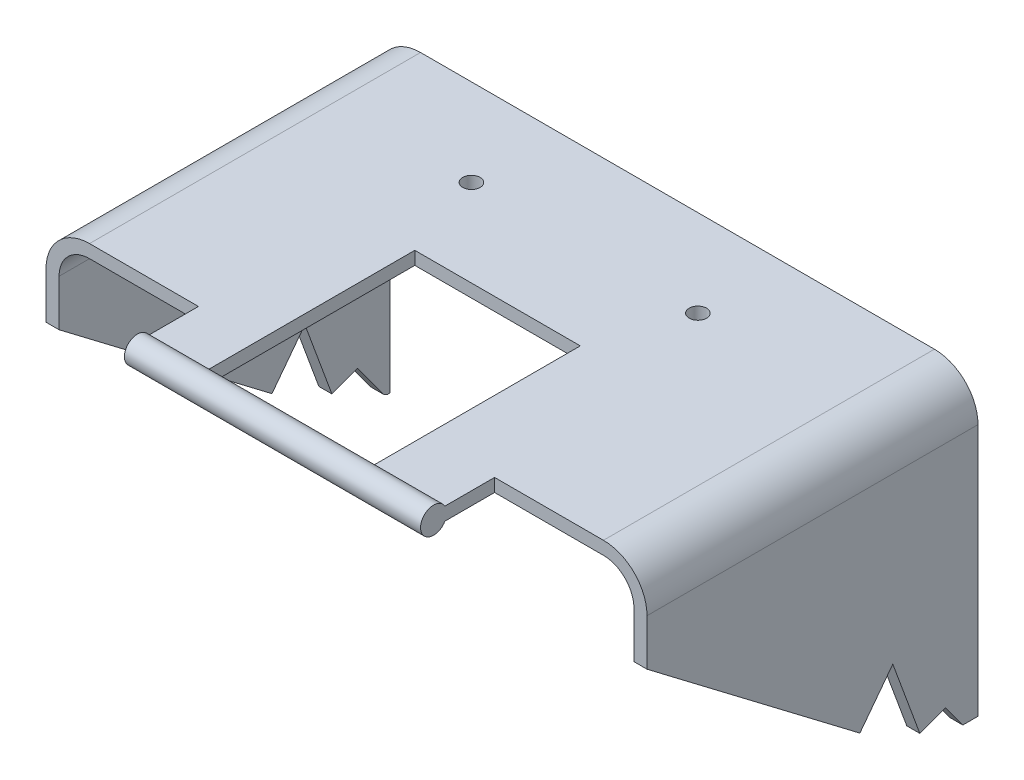
ISO-10303-21;
HEADER;
FILE_DESCRIPTION(('STEP AP214'),'2;1');
FILE_NAME('part.step','',(''),(''),'','','');
FILE_SCHEMA(('AUTOMOTIVE_DESIGN { 1 0 10303 214 1 1 1 1 }'));
ENDSEC;
DATA;
#1=APPLICATION_CONTEXT('core data for automotive mechanical design processes');
#2=APPLICATION_PROTOCOL_DEFINITION('international standard','automotive_design',2000,#1);
#3=PRODUCT_CONTEXT('',#1,'mechanical');
#4=PRODUCT('Part','Part','',(#3));
#5=PRODUCT_RELATED_PRODUCT_CATEGORY('part','',(#4));
#6=PRODUCT_DEFINITION_FORMATION('','',#4);
#7=PRODUCT_DEFINITION_CONTEXT('part definition',#1,'design');
#8=PRODUCT_DEFINITION('design','',#6,#7);
#9=PRODUCT_DEFINITION_SHAPE('','',#8);
#10=(LENGTH_UNIT() NAMED_UNIT(*) SI_UNIT(.MILLI.,.METRE.));
#11=(NAMED_UNIT(*) PLANE_ANGLE_UNIT() SI_UNIT($,.RADIAN.));
#12=(NAMED_UNIT(*) SI_UNIT($,.STERADIAN.) SOLID_ANGLE_UNIT());
#13=UNCERTAINTY_MEASURE_WITH_UNIT(LENGTH_MEASURE(1.E-05),#10,'distance_accuracy_value','');
#14=(GEOMETRIC_REPRESENTATION_CONTEXT(3) GLOBAL_UNCERTAINTY_ASSIGNED_CONTEXT((#13)) GLOBAL_UNIT_ASSIGNED_CONTEXT((#10,
#11,#12)) REPRESENTATION_CONTEXT('',''));
#15=CARTESIAN_POINT('',(0.,0.,0.));
#16=DIRECTION('',(0.,0.,1.));
#17=DIRECTION('',(1.,0.,0.));
#18=AXIS2_PLACEMENT_3D('',#15,#16,#17);
#19=CARTESIAN_POINT('',(67.3185788523201,-10.,90.));
#20=DIRECTION('',(1.,0.,0.));
#21=DIRECTION('',(0.,1.,0.));
#22=AXIS2_PLACEMENT_3D('',#19,#20,#21);
#23=PLANE('',#22);
#24=DIRECTION('',(0.,0.605102564382151,0.79614752814924));
#25=VECTOR('',#24,1.);
#26=CARTESIAN_POINT('',(67.3185788523201,-10.,90.));
#27=LINE('',#26,#25);
#28=CARTESIAN_POINT('',(67.3185788523201,-57.7914741257097,27.1196451123245));
#29=VERTEX_POINT('',#28);
#30=CARTESIAN_POINT('',(67.3185788523201,-20.6405353302336,76.));
#31=VERTEX_POINT('',#30);
#32=EDGE_CURVE('E387',#29,#31,#27,.T.);
#33=ORIENTED_EDGE('',*,*,#32,.T.);
#34=DIRECTION('',(0.,1.,0.));
#35=VECTOR('',#34,1.);
#36=CARTESIAN_POINT('',(67.3185788523201,-10.,76.));
#37=LINE('',#36,#35);
#38=CARTESIAN_POINT('',(67.3185788523201,-10.,76.));
#39=VERTEX_POINT('',#38);
#40=EDGE_CURVE('E548',#31,#39,#37,.T.);
#41=ORIENTED_EDGE('',*,*,#40,.T.);
#42=DIRECTION('',(0.,0.,-1.));
#43=VECTOR('',#42,1.);
#44=CARTESIAN_POINT('',(67.3185788523201,-10.,90.));
#45=LINE('',#44,#43);
#46=CARTESIAN_POINT('',(67.3185788523201,-10.,0.));
#47=VERTEX_POINT('',#46);
#48=EDGE_CURVE('E459',#39,#47,#45,.T.);
#49=ORIENTED_EDGE('',*,*,#48,.T.);
#50=DIRECTION('',(0.,-1.,0.));
#51=VECTOR('',#50,1.);
#52=CARTESIAN_POINT('',(67.3185788523201,-10.,0.));
#53=LINE('',#52,#51);
#54=CARTESIAN_POINT('',(67.3185788523201,-68.,0.));
#55=VERTEX_POINT('',#54);
#56=EDGE_CURVE('E412',#47,#55,#53,.T.);
#57=ORIENTED_EDGE('',*,*,#56,.T.);
#58=DIRECTION('',(0.,0.,-1.));
#59=VECTOR('',#58,1.);
#60=CARTESIAN_POINT('',(67.3185788523201,-68.,90.));
#61=LINE('',#60,#59);
#62=CARTESIAN_POINT('',(67.3185788523201,-68.,3.48584445575875));
#63=VERTEX_POINT('',#62);
#64=EDGE_CURVE('E490',#63,#55,#61,.T.);
#65=ORIENTED_EDGE('',*,*,#64,.F.);
#66=DIRECTION('',(0.,0.809168117123612,0.587577193422811));
#67=VECTOR('',#66,1.);
#68=CARTESIAN_POINT('',(67.3185788523201,11.1087219127441,60.9306199147688));
#69=LINE('',#68,#67);
#70=CARTESIAN_POINT('',(67.3185788523201,-62.5605412613657,7.43570584024735));
#71=VERTEX_POINT('',#70);
#72=EDGE_CURVE('E406',#63,#71,#69,.T.);
#73=ORIENTED_EDGE('',*,*,#72,.T.);
#74=DIRECTION('',(0.,-0.345416333019234,0.938449549460996));
#75=VECTOR('',#74,1.);
#76=CARTESIAN_POINT('',(67.3185788523201,-83.0531096699893,63.1112479383119));
#77=LINE('',#76,#75);
#78=CARTESIAN_POINT('',(67.3185788523201,-64.7369400636954,13.3486875966138));
#79=VERTEX_POINT('',#78);
#80=EDGE_CURVE('E399',#71,#79,#77,.T.);
#81=ORIENTED_EDGE('',*,*,#80,.T.);
#82=DIRECTION('',(0.,0.938449549460996,0.345416333019234));
#83=VECTOR('',#82,1.);
#84=CARTESIAN_POINT('',(67.3185788523201,8.31616960629392,40.2374396583019));
#85=LINE('',#84,#83);
#86=CARTESIAN_POINT('',(67.3185788523201,-47.8504793112289,19.5641089308137));
#87=VERTEX_POINT('',#86);
#88=EDGE_CURVE('E395',#79,#87,#85,.T.);
#89=ORIENTED_EDGE('',*,*,#88,.T.);
#90=DIRECTION('',(0.,-0.79614752814924,0.605102564382151));
#91=VECTOR('',#90,1.);
#92=CARTESIAN_POINT('',(67.3185788523201,-57.7914741257097,27.1196451123245));
#93=LINE('',#92,#91);
#94=EDGE_CURVE('E391',#87,#29,#93,.T.);
#95=ORIENTED_EDGE('',*,*,#94,.T.);
#96=EDGE_LOOP('',(#33,#41,#49,#57,#65,#73,#81,#89,#95));
#97=FACE_BOUND('',#96,.T.);
#98=ADVANCED_FACE('F39',(#97),#23,.F.);
#99=CARTESIAN_POINT('',(70.3185788523201,-68.,90.));
#100=DIRECTION('',(0.,-1.,0.));
#101=DIRECTION('',(0.,0.,-1.));
#102=AXIS2_PLACEMENT_3D('',#99,#100,#101);
#103=PLANE('',#102);
#104=DIRECTION('',(1.,0.,0.));
#105=VECTOR('',#104,1.);
#106=CARTESIAN_POINT('',(70.3185788523201,-68.,3.48584445575875));
#107=LINE('',#106,#105);
#108=CARTESIAN_POINT('',(70.3185788523201,-68.,3.48584445575875));
#109=VERTEX_POINT('',#108);
#110=EDGE_CURVE('E403',#63,#109,#107,.T.);
#111=ORIENTED_EDGE('',*,*,#110,.F.);
#112=ORIENTED_EDGE('',*,*,#64,.T.);
#113=DIRECTION('',(-1.,0.,0.));
#114=VECTOR('',#113,1.);
#115=CARTESIAN_POINT('',(70.3185788523201,-68.,0.));
#116=LINE('',#115,#114);
#117=CARTESIAN_POINT('',(70.3185788523201,-68.,0.));
#118=VERTEX_POINT('',#117);
#119=EDGE_CURVE('E416',#118,#55,#116,.T.);
#120=ORIENTED_EDGE('',*,*,#119,.F.);
#121=DIRECTION('',(0.,0.,-1.));
#122=VECTOR('',#121,1.);
#123=CARTESIAN_POINT('',(70.3185788523201,-68.,90.));
#124=LINE('',#123,#122);
#125=EDGE_CURVE('E487',#109,#118,#124,.T.);
#126=ORIENTED_EDGE('',*,*,#125,.F.);
#127=EDGE_LOOP('',(#111,#112,#120,#126));
#128=FACE_BOUND('',#127,.T.);
#129=ADVANCED_FACE('F540',(#128),#103,.T.);
#130=CARTESIAN_POINT('',(70.3185788523201,-10.,90.));
#131=DIRECTION('',(1.,0.,0.));
#132=DIRECTION('',(0.,1.,0.));
#133=AXIS2_PLACEMENT_3D('',#130,#131,#132);
#134=PLANE('',#133);
#135=DIRECTION('',(0.,1.,0.));
#136=VECTOR('',#135,1.);
#137=CARTESIAN_POINT('',(70.3185788523201,-71.208727912805,76.));
#138=LINE('',#137,#136);
#139=CARTESIAN_POINT('',(70.3185788523201,-20.6405353302337,76.));
#140=VERTEX_POINT('',#139);
#141=CARTESIAN_POINT('',(70.3185788523201,-10.,76.));
#142=VERTEX_POINT('',#141);
#143=EDGE_CURVE('E561',#140,#142,#138,.T.);
#144=ORIENTED_EDGE('',*,*,#143,.F.);
#145=DIRECTION('',(0.,-0.605102564382151,-0.79614752814924));
#146=VECTOR('',#145,1.);
#147=CARTESIAN_POINT('',(70.3185788523201,-10.0000000000001,90.));
#148=LINE('',#147,#146);
#149=CARTESIAN_POINT('',(70.3185788523201,-57.7914741257097,27.1196451123245));
#150=VERTEX_POINT('',#149);
#151=EDGE_CURVE('E326',#140,#150,#148,.T.);
#152=ORIENTED_EDGE('',*,*,#151,.T.);
#153=DIRECTION('',(0.,0.79614752814924,-0.605102564382151));
#154=VECTOR('',#153,1.);
#155=CARTESIAN_POINT('',(70.3185788523201,-57.7914741257097,27.1196451123245));
#156=LINE('',#155,#154);
#157=CARTESIAN_POINT('',(70.3185788523201,-47.8504793112289,19.5641089308137));
#158=VERTEX_POINT('',#157);
#159=EDGE_CURVE('E329',#150,#158,#156,.T.);
#160=ORIENTED_EDGE('',*,*,#159,.T.);
#161=DIRECTION('',(0.,-0.938449549460996,-0.345416333019234));
#162=VECTOR('',#161,1.);
#163=CARTESIAN_POINT('',(70.3185788523201,-47.8504793112289,19.5641089308137));
#164=LINE('',#163,#162);
#165=CARTESIAN_POINT('',(70.3185788523201,-64.7369400636954,13.3486875966138));
#166=VERTEX_POINT('',#165);
#167=EDGE_CURVE('E334',#158,#166,#164,.T.);
#168=ORIENTED_EDGE('',*,*,#167,.T.);
#169=DIRECTION('',(0.,0.345416333019234,-0.938449549460996));
#170=VECTOR('',#169,1.);
#171=CARTESIAN_POINT('',(70.3185788523201,-64.7369400636954,13.3486875966138));
#172=LINE('',#171,#170);
#173=CARTESIAN_POINT('',(70.3185788523201,-62.5605412613657,7.43570584024735));
#174=VERTEX_POINT('',#173);
#175=EDGE_CURVE('E338',#166,#174,#172,.T.);
#176=ORIENTED_EDGE('',*,*,#175,.T.);
#177=DIRECTION('',(0.,-0.809168117123612,-0.587577193422812));
#178=VECTOR('',#177,1.);
#179=CARTESIAN_POINT('',(70.3185788523201,-62.5605412613657,7.43570584024735));
#180=LINE('',#179,#178);
#181=EDGE_CURVE('E342',#174,#109,#180,.T.);
#182=ORIENTED_EDGE('',*,*,#181,.T.);
#183=ORIENTED_EDGE('',*,*,#125,.T.);
#184=DIRECTION('',(0.,-1.,0.));
#185=VECTOR('',#184,1.);
#186=CARTESIAN_POINT('',(70.3185788523201,-10.,0.));
#187=LINE('',#186,#185);
#188=CARTESIAN_POINT('',(70.3185788523201,-10.,0.));
#189=VERTEX_POINT('',#188);
#190=EDGE_CURVE('E420',#189,#118,#187,.T.);
#191=ORIENTED_EDGE('',*,*,#190,.F.);
#192=DIRECTION('',(0.,0.,-1.));
#193=VECTOR('',#192,1.);
#194=CARTESIAN_POINT('',(70.3185788523201,-10.,90.));
#195=LINE('',#194,#193);
#196=EDGE_CURVE('E484',#142,#189,#195,.T.);
#197=ORIENTED_EDGE('',*,*,#196,.F.);
#198=EDGE_LOOP('',(#144,#152,#160,#168,#176,#182,#183,#191,#197));
#199=FACE_BOUND('',#198,.T.);
#200=ADVANCED_FACE('F545',(#199),#134,.T.);
#201=CARTESIAN_POINT('',(60.3185788523201,-10.,90.));
#202=DIRECTION('',(0.,0.,-1.));
#203=DIRECTION('',(-1.,0.,0.));
#204=AXIS2_PLACEMENT_3D('',#201,#202,#203);
#205=CYLINDRICAL_SURFACE('',#204,10.);
#206=CARTESIAN_POINT('',(60.3185788523201,-10.,76.));
#207=DIRECTION('',(0.,0.,-1.));
#208=DIRECTION('',(-1.,0.,0.));
#209=AXIS2_PLACEMENT_3D('',#206,#207,#208);
#210=CIRCLE('',#209,10.);
#211=CARTESIAN_POINT('',(60.3185788523201,0.,76.));
#212=VERTEX_POINT('',#211);
#213=EDGE_CURVE('E602',#142,#212,#210,.F.);
#214=ORIENTED_EDGE('',*,*,#213,.F.);
#215=ORIENTED_EDGE('',*,*,#196,.T.);
#216=CARTESIAN_POINT('',(60.3185788523201,-10.,0.));
#217=DIRECTION('',(0.,0.,-1.));
#218=DIRECTION('',(-1.,0.,0.));
#219=AXIS2_PLACEMENT_3D('',#216,#217,#218);
#220=CIRCLE('',#219,10.);
#221=CARTESIAN_POINT('',(60.3185788523201,0.,0.));
#222=VERTEX_POINT('',#221);
#223=EDGE_CURVE('E424',#222,#189,#220,.T.);
#224=ORIENTED_EDGE('',*,*,#223,.F.);
#225=DIRECTION('',(0.,0.,-1.));
#226=VECTOR('',#225,1.);
#227=CARTESIAN_POINT('',(60.3185788523201,0.,90.));
#228=LINE('',#227,#226);
#229=EDGE_CURVE('E481',#212,#222,#228,.T.);
#230=ORIENTED_EDGE('',*,*,#229,.F.);
#231=EDGE_LOOP('',(#214,#215,#224,#230));
#232=FACE_BOUND('',#231,.T.);
#233=ADVANCED_FACE('F688',(#232),#205,.T.);
#234=CARTESIAN_POINT('',(-57.6814211476798,0.,90.));
#235=DIRECTION('',(0.,1.,0.));
#236=DIRECTION('',(-1.,0.,0.));
#237=AXIS2_PLACEMENT_3D('',#234,#235,#236);
#238=PLANE('',#237);
#239=DIRECTION('',(-1.,0.,0.));
#240=VECTOR('',#239,1.);
#241=CARTESIAN_POINT('',(43.8038602265587,0.,87.4019237886466));
#242=LINE('',#241,#240);
#243=CARTESIAN_POINT('',(35.3185788523201,0.,87.4019237886466));
#244=VERTEX_POINT('',#243);
#245=CARTESIAN_POINT('',(19.,0.,87.4019237886466));
#246=VERTEX_POINT('',#245);
#247=EDGE_CURVE('E57',#244,#246,#242,.T.);
#248=ORIENTED_EDGE('',*,*,#247,.F.);
#249=DIRECTION('',(0.,0.,1.));
#250=VECTOR('',#249,1.);
#251=CARTESIAN_POINT('',(35.3185788523201,0.,76.));
#252=LINE('',#251,#250);
#253=CARTESIAN_POINT('',(35.3185788523201,0.,76.));
#254=VERTEX_POINT('',#253);
#255=EDGE_CURVE('E302',#254,#244,#252,.T.);
#256=ORIENTED_EDGE('',*,*,#255,.F.);
#257=DIRECTION('',(-1.,0.,0.));
#258=VECTOR('',#257,1.);
#259=CARTESIAN_POINT('',(35.3185788523201,0.,76.));
#260=LINE('',#259,#258);
#261=EDGE_CURVE('E567',#212,#254,#260,.T.);
#262=ORIENTED_EDGE('',*,*,#261,.F.);
#263=ORIENTED_EDGE('',*,*,#229,.T.);
#264=DIRECTION('',(1.,0.,0.));
#265=VECTOR('',#264,1.);
#266=CARTESIAN_POINT('',(-57.6814211476798,0.,0.));
#267=LINE('',#266,#265);
#268=CARTESIAN_POINT('',(-57.6814211476798,0.,0.));
#269=VERTEX_POINT('',#268);
#270=EDGE_CURVE('E428',#269,#222,#267,.T.);
#271=ORIENTED_EDGE('',*,*,#270,.F.);
#272=DIRECTION('',(0.,0.,-1.));
#273=VECTOR('',#272,1.);
#274=CARTESIAN_POINT('',(-57.6814211476798,0.,90.));
#275=LINE('',#274,#273);
#276=CARTESIAN_POINT('',(-57.6814211476799,0.,76.));
#277=VERTEX_POINT('',#276);
#278=EDGE_CURVE('E478',#277,#269,#275,.T.);
#279=ORIENTED_EDGE('',*,*,#278,.F.);
#280=DIRECTION('',(-1.,0.,0.));
#281=VECTOR('',#280,1.);
#282=CARTESIAN_POINT('',(-32.6814211476799,0.,76.));
#283=LINE('',#282,#281);
#284=CARTESIAN_POINT('',(-32.6814211476799,0.,76.));
#285=VERTEX_POINT('',#284);
#286=EDGE_CURVE('E647',#285,#277,#283,.T.);
#287=ORIENTED_EDGE('',*,*,#286,.F.);
#288=DIRECTION('',(0.,0.,-1.));
#289=VECTOR('',#288,1.);
#290=CARTESIAN_POINT('',(-32.6814211476799,0.,76.));
#291=LINE('',#290,#289);
#292=CARTESIAN_POINT('',(-32.6814211476799,0.,87.4019237886467));
#293=VERTEX_POINT('',#292);
#294=EDGE_CURVE('E627',#293,#285,#291,.T.);
#295=ORIENTED_EDGE('',*,*,#294,.F.);
#296=CARTESIAN_POINT('',(-19.,0.,87.4019237886467));
#297=VERTEX_POINT('',#296);
#298=EDGE_CURVE('E661',#297,#293,#242,.T.);
#299=ORIENTED_EDGE('',*,*,#298,.F.);
#300=DIRECTION('',(0.,0.,1.));
#301=VECTOR('',#300,1.);
#302=CARTESIAN_POINT('',(-19.,0.,40.));
#303=LINE('',#302,#301);
#304=CARTESIAN_POINT('',(-19.,0.,40.));
#305=VERTEX_POINT('',#304);
#306=EDGE_CURVE('E624',#305,#297,#303,.T.);
#307=ORIENTED_EDGE('',*,*,#306,.F.);
#308=DIRECTION('',(-1.,0.,0.));
#309=VECTOR('',#308,1.);
#310=CARTESIAN_POINT('',(19.,0.,40.));
#311=LINE('',#310,#309);
#312=CARTESIAN_POINT('',(19.,0.,40.));
#313=VERTEX_POINT('',#312);
#314=EDGE_CURVE('E631',#313,#305,#311,.T.);
#315=ORIENTED_EDGE('',*,*,#314,.F.);
#316=DIRECTION('',(0.,0.,-1.));
#317=VECTOR('',#316,1.);
#318=CARTESIAN_POINT('',(19.,0.,40.));
#319=LINE('',#318,#317);
#320=EDGE_CURVE('E623',#246,#313,#319,.T.);
#321=ORIENTED_EDGE('',*,*,#320,.F.);
#322=EDGE_LOOP('',(#248,#256,#262,#263,#271,#279,#287,#295,#299,#307,#315,#321));
#323=FACE_BOUND('',#322,.T.);
#324=CARTESIAN_POINT('',(-26.,0.,20.));
#325=DIRECTION('',(0.,1.,0.));
#326=DIRECTION('',(-1.,0.,0.));
#327=AXIS2_PLACEMENT_3D('',#324,#325,#326);
#328=CIRCLE('',#327,2.);
#329=CARTESIAN_POINT('',(-28.,0.,20.));
#330=VERTEX_POINT('',#329);
#331=EDGE_CURVE('E569',#330,#330,#328,.T.);
#332=ORIENTED_EDGE('',*,*,#331,.F.);
#333=EDGE_LOOP('',(#332));
#334=FACE_BOUND('',#333,.T.);
#335=CARTESIAN_POINT('',(26.,0.,20.));
#336=DIRECTION('',(0.,1.,0.));
#337=DIRECTION('',(-1.,0.,0.));
#338=AXIS2_PLACEMENT_3D('',#335,#336,#337);
#339=CIRCLE('',#338,2.00000000000001);
#340=CARTESIAN_POINT('',(24.,0.,20.));
#341=VERTEX_POINT('',#340);
#342=EDGE_CURVE('E575',#341,#341,#339,.T.);
#343=ORIENTED_EDGE('',*,*,#342,.F.);
#344=EDGE_LOOP('',(#343));
#345=FACE_BOUND('',#344,.T.);
#346=ADVANCED_FACE('F658',(#323,#334,#345),#238,.T.);
#347=CARTESIAN_POINT('',(-57.6814211476799,-10.,90.));
#348=DIRECTION('',(0.,0.,-1.));
#349=DIRECTION('',(-1.,0.,0.));
#350=AXIS2_PLACEMENT_3D('',#347,#348,#349);
#351=CYLINDRICAL_SURFACE('',#350,10.);
#352=CARTESIAN_POINT('',(-57.6814211476799,-10.,76.));
#353=DIRECTION('',(0.,0.,-1.));
#354=DIRECTION('',(-1.,0.,0.));
#355=AXIS2_PLACEMENT_3D('',#352,#353,#354);
#356=CIRCLE('',#355,10.);
#357=CARTESIAN_POINT('',(-67.6814211476799,-10.0000000000001,76.));
#358=VERTEX_POINT('',#357);
#359=EDGE_CURVE('E591',#277,#358,#356,.F.);
#360=ORIENTED_EDGE('',*,*,#359,.F.);
#361=ORIENTED_EDGE('',*,*,#278,.T.);
#362=CARTESIAN_POINT('',(-57.6814211476799,-10.,0.));
#363=DIRECTION('',(0.,0.,-1.));
#364=DIRECTION('',(1.,0.,0.));
#365=AXIS2_PLACEMENT_3D('',#362,#363,#364);
#366=CIRCLE('',#365,10.);
#367=CARTESIAN_POINT('',(-67.6814211476799,-10.0000000000001,0.));
#368=VERTEX_POINT('',#367);
#369=EDGE_CURVE('E432',#368,#269,#366,.T.);
#370=ORIENTED_EDGE('',*,*,#369,.F.);
#371=DIRECTION('',(0.,0.,-1.));
#372=VECTOR('',#371,1.);
#373=CARTESIAN_POINT('',(-67.6814211476799,-10.0000000000001,90.));
#374=LINE('',#373,#372);
#375=EDGE_CURVE('E475',#358,#368,#374,.T.);
#376=ORIENTED_EDGE('',*,*,#375,.F.);
#377=EDGE_LOOP('',(#360,#361,#370,#376));
#378=FACE_BOUND('',#377,.T.);
#379=ADVANCED_FACE('F695',(#378),#351,.T.);
#380=CARTESIAN_POINT('',(-67.6814211476799,-71.208727912805,90.));
#381=DIRECTION('',(-1.,0.,0.));
#382=DIRECTION('',(0.,0.,1.));
#383=AXIS2_PLACEMENT_3D('',#380,#381,#382);
#384=PLANE('',#383);
#385=DIRECTION('',(0.,1.,0.));
#386=VECTOR('',#385,1.);
#387=CARTESIAN_POINT('',(-67.6814211476799,-71.208727912805,76.));
#388=LINE('',#387,#386);
#389=CARTESIAN_POINT('',(-67.6814211476799,-20.6405353302336,76.));
#390=VERTEX_POINT('',#389);
#391=EDGE_CURVE('E636',#390,#358,#388,.T.);
#392=ORIENTED_EDGE('',*,*,#391,.T.);
#393=ORIENTED_EDGE('',*,*,#375,.T.);
#394=DIRECTION('',(0.,1.,0.));
#395=VECTOR('',#394,1.);
#396=CARTESIAN_POINT('',(-67.6814211476799,-71.208727912805,0.));
#397=LINE('',#396,#395);
#398=CARTESIAN_POINT('',(-67.6814211476799,-71.208727912805,0.));
#399=VERTEX_POINT('',#398);
#400=EDGE_CURVE('E436',#399,#368,#397,.T.);
#401=ORIENTED_EDGE('',*,*,#400,.F.);
#402=DIRECTION('',(0.,0.,-1.));
#403=VECTOR('',#402,1.);
#404=CARTESIAN_POINT('',(-67.6814211476799,-71.208727912805,90.));
#405=LINE('',#404,#403);
#406=CARTESIAN_POINT('',(-67.6814211476799,-71.208727912805,0.516904053718919));
#407=VERTEX_POINT('',#406);
#408=EDGE_CURVE('E473',#407,#399,#405,.T.);
#409=ORIENTED_EDGE('',*,*,#408,.F.);
#410=DIRECTION('',(0.,-0.450322395088901,-0.892866026053963));
#411=VECTOR('',#410,1.);
#412=CARTESIAN_POINT('',(-67.6814211476799,-70.7002642040308,1.52504838763816));
#413=LINE('',#412,#411);
#414=CARTESIAN_POINT('',(-67.6814211476799,-70.7002642040308,1.52504838763816));
#415=VERTEX_POINT('',#414);
#416=EDGE_CURVE('E330',#415,#407,#413,.T.);
#417=ORIENTED_EDGE('',*,*,#416,.F.);
#418=DIRECTION('',(0.,-0.809168117123612,-0.587577193422812));
#419=VECTOR('',#418,1.);
#420=CARTESIAN_POINT('',(-67.6814211476799,-62.5605412613657,7.43570584024735));
#421=LINE('',#420,#419);
#422=CARTESIAN_POINT('',(-67.6814211476799,-62.5605412613657,7.43570584024735));
#423=VERTEX_POINT('',#422);
#424=EDGE_CURVE('E359',#423,#415,#421,.T.);
#425=ORIENTED_EDGE('',*,*,#424,.F.);
#426=DIRECTION('',(0.,0.345416333019234,-0.938449549460996));
#427=VECTOR('',#426,1.);
#428=CARTESIAN_POINT('',(-67.6814211476799,-64.7369400636954,13.3486875966138));
#429=LINE('',#428,#427);
#430=CARTESIAN_POINT('',(-67.6814211476799,-64.7369400636954,13.3486875966138));
#431=VERTEX_POINT('',#430);
#432=EDGE_CURVE('E356',#431,#423,#429,.T.);
#433=ORIENTED_EDGE('',*,*,#432,.F.);
#434=DIRECTION('',(0.,-0.938449549460996,-0.345416333019234));
#435=VECTOR('',#434,1.);
#436=CARTESIAN_POINT('',(-67.6814211476799,-47.8504793112289,19.5641089308137));
#437=LINE('',#436,#435);
#438=CARTESIAN_POINT('',(-67.6814211476799,-47.8504793112289,19.5641089308137));
#439=VERTEX_POINT('',#438);
#440=EDGE_CURVE('E353',#439,#431,#437,.T.);
#441=ORIENTED_EDGE('',*,*,#440,.F.);
#442=DIRECTION('',(0.,0.79614752814924,-0.605102564382151));
#443=VECTOR('',#442,1.);
#444=CARTESIAN_POINT('',(-67.6814211476799,-57.7914741257097,27.1196451123245));
#445=LINE('',#444,#443);
#446=CARTESIAN_POINT('',(-67.6814211476799,-57.7914741257097,27.1196451123245));
#447=VERTEX_POINT('',#446);
#448=EDGE_CURVE('E350',#447,#439,#445,.T.);
#449=ORIENTED_EDGE('',*,*,#448,.F.);
#450=DIRECTION('',(0.,-0.605102564382151,-0.79614752814924));
#451=VECTOR('',#450,1.);
#452=CARTESIAN_POINT('',(-67.6814211476799,-10.0000000000001,90.));
#453=LINE('',#452,#451);
#454=EDGE_CURVE('E347',#390,#447,#453,.T.);
#455=ORIENTED_EDGE('',*,*,#454,.F.);
#456=EDGE_LOOP('',(#392,#393,#401,#409,#417,#425,#433,#441,#449,#455));
#457=FACE_BOUND('',#456,.T.);
#458=ADVANCED_FACE('F702',(#457),#384,.T.);
#459=CARTESIAN_POINT('',(-64.6814211476799,-71.208727912805,90.));
#460=DIRECTION('',(0.,-1.,0.));
#461=DIRECTION('',(0.,0.,-1.));
#462=AXIS2_PLACEMENT_3D('',#459,#460,#461);
#463=PLANE('',#462);
#464=DIRECTION('',(1.,0.,0.));
#465=VECTOR('',#464,1.);
#466=CARTESIAN_POINT('',(-64.6814211476799,-71.208727912805,0.516904053718917));
#467=LINE('',#466,#465);
#468=CARTESIAN_POINT('',(-64.6814211476799,-71.208727912805,0.516904053718903));
#469=VERTEX_POINT('',#468);
#470=EDGE_CURVE('E410',#407,#469,#467,.T.);
#471=ORIENTED_EDGE('',*,*,#470,.F.);
#472=ORIENTED_EDGE('',*,*,#408,.T.);
#473=DIRECTION('',(-1.,0.,0.));
#474=VECTOR('',#473,1.);
#475=CARTESIAN_POINT('',(-64.6814211476799,-71.208727912805,0.));
#476=LINE('',#475,#474);
#477=CARTESIAN_POINT('',(-64.6814211476799,-71.208727912805,0.));
#478=VERTEX_POINT('',#477);
#479=EDGE_CURVE('E440',#478,#399,#476,.T.);
#480=ORIENTED_EDGE('',*,*,#479,.F.);
#481=DIRECTION('',(0.,0.,-1.));
#482=VECTOR('',#481,1.);
#483=CARTESIAN_POINT('',(-64.6814211476799,-71.208727912805,90.));
#484=LINE('',#483,#482);
#485=EDGE_CURVE('E471',#469,#478,#484,.T.);
#486=ORIENTED_EDGE('',*,*,#485,.F.);
#487=EDGE_LOOP('',(#471,#472,#480,#486));
#488=FACE_BOUND('',#487,.T.);
#489=ADVANCED_FACE('F762',(#488),#463,.T.);
#490=CARTESIAN_POINT('',(-64.6814211476799,-71.208727912805,90.));
#491=DIRECTION('',(-1.,0.,0.));
#492=DIRECTION('',(0.,0.,1.));
#493=AXIS2_PLACEMENT_3D('',#490,#491,#492);
#494=PLANE('',#493);
#495=DIRECTION('',(0.,0.,-1.));
#496=VECTOR('',#495,1.);
#497=CARTESIAN_POINT('',(-64.6814211476799,-10.,90.));
#498=LINE('',#497,#496);
#499=CARTESIAN_POINT('',(-64.6814211476799,-10.,76.));
#500=VERTEX_POINT('',#499);
#501=CARTESIAN_POINT('',(-64.6814211476799,-10.,0.));
#502=VERTEX_POINT('',#501);
#503=EDGE_CURVE('E468',#500,#502,#498,.T.);
#504=ORIENTED_EDGE('',*,*,#503,.F.);
#505=DIRECTION('',(0.,-1.,0.));
#506=VECTOR('',#505,1.);
#507=CARTESIAN_POINT('',(-64.6814211476799,-71.208727912805,76.));
#508=LINE('',#507,#506);
#509=CARTESIAN_POINT('',(-64.6814211476799,-20.6405353302336,76.));
#510=VERTEX_POINT('',#509);
#511=EDGE_CURVE('E579',#500,#510,#508,.T.);
#512=ORIENTED_EDGE('',*,*,#511,.T.);
#513=DIRECTION('',(0.,-0.605102564382151,-0.79614752814924));
#514=VECTOR('',#513,1.);
#515=CARTESIAN_POINT('',(-64.6814211476799,-32.4115214589531,60.5126395723874));
#516=LINE('',#515,#514);
#517=CARTESIAN_POINT('',(-64.6814211476799,-57.7914741257097,27.1196451123245));
#518=VERTEX_POINT('',#517);
#519=EDGE_CURVE('E365',#510,#518,#516,.T.);
#520=ORIENTED_EDGE('',*,*,#519,.T.);
#521=DIRECTION('',(0.,0.79614752814924,-0.605102564382151));
#522=VECTOR('',#521,1.);
#523=CARTESIAN_POINT('',(-64.6814211476799,-96.5886805795616,56.6070055399371));
#524=LINE('',#523,#522);
#525=CARTESIAN_POINT('',(-64.6814211476799,-47.8504793112289,19.5641089308137));
#526=VERTEX_POINT('',#525);
#527=EDGE_CURVE('E493',#518,#526,#524,.T.);
#528=ORIENTED_EDGE('',*,*,#527,.T.);
#529=DIRECTION('',(0.,-0.938449549460996,-0.345416333019234));
#530=VECTOR('',#529,1.);
#531=CARTESIAN_POINT('',(-64.6814211476799,-45.589595439184,20.3962753663058));
#532=LINE('',#531,#530);
#533=CARTESIAN_POINT('',(-64.6814211476799,-64.7369400636954,13.3486875966138));
#534=VERTEX_POINT('',#533);
#535=EDGE_CURVE('E496',#526,#534,#532,.T.);
#536=ORIENTED_EDGE('',*,*,#535,.T.);
#537=DIRECTION('',(0.,0.345416333019234,-0.938449549460996));
#538=VECTOR('',#537,1.);
#539=CARTESIAN_POINT('',(-64.6814211476799,-90.3560725373164,82.952412230308));
#540=LINE('',#539,#538);
#541=CARTESIAN_POINT('',(-64.6814211476799,-62.5605412613657,7.43570584024735));
#542=VERTEX_POINT('',#541);
#543=EDGE_CURVE('E499',#534,#542,#540,.T.);
#544=ORIENTED_EDGE('',*,*,#543,.T.);
#545=DIRECTION('',(0.,-0.809168117123612,-0.587577193422811));
#546=VECTOR('',#545,1.);
#547=CARTESIAN_POINT('',(-64.6814211476799,-28.9678788709988,31.8290078861762));
#548=LINE('',#547,#546);
#549=CARTESIAN_POINT('',(-64.6814211476799,-70.7002642040308,1.52504838763816));
#550=VERTEX_POINT('',#549);
#551=EDGE_CURVE('E502',#542,#550,#548,.T.);
#552=ORIENTED_EDGE('',*,*,#551,.T.);
#553=DIRECTION('',(0.,-0.450322395088901,-0.892866026053963));
#554=VECTOR('',#553,1.);
#555=CARTESIAN_POINT('',(-64.6814211476799,-35.229582376124,71.8536997505255));
#556=LINE('',#555,#554);
#557=EDGE_CURVE('E505',#550,#469,#556,.T.);
#558=ORIENTED_EDGE('',*,*,#557,.T.);
#559=ORIENTED_EDGE('',*,*,#485,.T.);
#560=DIRECTION('',(0.,1.,0.));
#561=VECTOR('',#560,1.);
#562=CARTESIAN_POINT('',(-64.6814211476799,-71.208727912805,0.));
#563=LINE('',#562,#561);
#564=EDGE_CURVE('E443',#478,#502,#563,.T.);
#565=ORIENTED_EDGE('',*,*,#564,.T.);
#566=EDGE_LOOP('',(#504,#512,#520,#528,#536,#544,#552,#558,#559,#565));
#567=FACE_BOUND('',#566,.T.);
#568=ADVANCED_FACE('F711',(#567),#494,.F.);
#569=CARTESIAN_POINT('',(-57.6814211476799,-10.,90.));
#570=DIRECTION('',(0.,0.,-1.));
#571=DIRECTION('',(-1.,0.,0.));
#572=AXIS2_PLACEMENT_3D('',#569,#570,#571);
#573=CYLINDRICAL_SURFACE('',#572,7.);
#574=DIRECTION('',(0.,0.,-1.));
#575=VECTOR('',#574,1.);
#576=CARTESIAN_POINT('',(-57.6814211476798,-3.,90.));
#577=LINE('',#576,#575);
#578=CARTESIAN_POINT('',(-57.6814211476798,-3.,76.));
#579=VERTEX_POINT('',#578);
#580=CARTESIAN_POINT('',(-57.6814211476798,-3.,0.));
#581=VERTEX_POINT('',#580);
#582=EDGE_CURVE('E465',#579,#581,#577,.T.);
#583=ORIENTED_EDGE('',*,*,#582,.F.);
#584=CARTESIAN_POINT('',(-57.6814211476799,-10.,76.));
#585=DIRECTION('',(0.,0.,-1.));
#586=DIRECTION('',(-1.,0.,0.));
#587=AXIS2_PLACEMENT_3D('',#584,#585,#586);
#588=CIRCLE('',#587,7.);
#589=EDGE_CURVE('E583',#579,#500,#588,.F.);
#590=ORIENTED_EDGE('',*,*,#589,.T.);
#591=ORIENTED_EDGE('',*,*,#503,.T.);
#592=CARTESIAN_POINT('',(-57.6814211476799,-10.,0.));
#593=DIRECTION('',(0.,0.,1.));
#594=DIRECTION('',(1.,0.,0.));
#595=AXIS2_PLACEMENT_3D('',#592,#593,#594);
#596=CIRCLE('',#595,7.);
#597=EDGE_CURVE('E447',#502,#581,#596,.F.);
#598=ORIENTED_EDGE('',*,*,#597,.T.);
#599=EDGE_LOOP('',(#583,#590,#591,#598));
#600=FACE_BOUND('',#599,.T.);
#601=ADVANCED_FACE('F714',(#600),#573,.F.);
#602=CARTESIAN_POINT('',(-57.6814211476798,-3.,90.));
#603=DIRECTION('',(0.,1.,0.));
#604=DIRECTION('',(-1.,0.,0.));
#605=AXIS2_PLACEMENT_3D('',#602,#603,#604);
#606=PLANE('',#605);
#607=CARTESIAN_POINT('',(-26.,-3.,20.));
#608=DIRECTION('',(0.,1.,0.));
#609=DIRECTION('',(-1.,0.,0.));
#610=AXIS2_PLACEMENT_3D('',#607,#608,#609);
#611=CIRCLE('',#610,2.);
#612=CARTESIAN_POINT('',(-28.,-3.,20.));
#613=VERTEX_POINT('',#612);
#614=EDGE_CURVE('E319',#613,#613,#611,.T.);
#615=ORIENTED_EDGE('',*,*,#614,.T.);
#616=EDGE_LOOP('',(#615));
#617=FACE_BOUND('',#616,.T.);
#618=DIRECTION('',(0.,0.,1.));
#619=VECTOR('',#618,1.);
#620=CARTESIAN_POINT('',(35.3185788523201,-3.,90.));
#621=LINE('',#620,#619);
#622=CARTESIAN_POINT('',(35.3185788523201,-3.,76.));
#623=VERTEX_POINT('',#622);
#624=CARTESIAN_POINT('',(35.3185788523201,-3.,87.4019237886466));
#625=VERTEX_POINT('',#624);
#626=EDGE_CURVE('E299',#623,#625,#621,.T.);
#627=ORIENTED_EDGE('',*,*,#626,.T.);
#628=DIRECTION('',(-1.,0.,0.));
#629=VECTOR('',#628,1.);
#630=CARTESIAN_POINT('',(43.8038602265587,-3.,87.4019237886466));
#631=LINE('',#630,#629);
#632=CARTESIAN_POINT('',(19.,-3.,87.4019237886466));
#633=VERTEX_POINT('',#632);
#634=EDGE_CURVE('E286',#625,#633,#631,.T.);
#635=ORIENTED_EDGE('',*,*,#634,.T.);
#636=DIRECTION('',(0.,0.,-1.));
#637=VECTOR('',#636,1.);
#638=CARTESIAN_POINT('',(19.,-3.,90.));
#639=LINE('',#638,#637);
#640=CARTESIAN_POINT('',(19.,-3.,40.));
#641=VERTEX_POINT('',#640);
#642=EDGE_CURVE('E322',#633,#641,#639,.T.);
#643=ORIENTED_EDGE('',*,*,#642,.T.);
#644=DIRECTION('',(-1.,0.,0.));
#645=VECTOR('',#644,1.);
#646=CARTESIAN_POINT('',(-57.6814211476798,-3.,40.));
#647=LINE('',#646,#645);
#648=CARTESIAN_POINT('',(-19.,-3.,40.));
#649=VERTEX_POINT('',#648);
#650=EDGE_CURVE('E47',#641,#649,#647,.T.);
#651=ORIENTED_EDGE('',*,*,#650,.T.);
#652=DIRECTION('',(0.,0.,1.));
#653=VECTOR('',#652,1.);
#654=CARTESIAN_POINT('',(-19.,-3.,90.));
#655=LINE('',#654,#653);
#656=CARTESIAN_POINT('',(-19.,-3.,87.4019237886467));
#657=VERTEX_POINT('',#656);
#658=EDGE_CURVE('E605',#649,#657,#655,.T.);
#659=ORIENTED_EDGE('',*,*,#658,.T.);
#660=CARTESIAN_POINT('',(-32.6814211476799,-3.,87.4019237886467));
#661=VERTEX_POINT('',#660);
#662=EDGE_CURVE('E68',#657,#661,#631,.T.);
#663=ORIENTED_EDGE('',*,*,#662,.T.);
#664=DIRECTION('',(0.,0.,-1.));
#665=VECTOR('',#664,1.);
#666=CARTESIAN_POINT('',(-32.6814211476799,-3.,90.));
#667=LINE('',#666,#665);
#668=CARTESIAN_POINT('',(-32.6814211476799,-3.,76.));
#669=VERTEX_POINT('',#668);
#670=EDGE_CURVE('E313',#661,#669,#667,.T.);
#671=ORIENTED_EDGE('',*,*,#670,.T.);
#672=DIRECTION('',(-1.,0.,0.));
#673=VECTOR('',#672,1.);
#674=CARTESIAN_POINT('',(-57.6814211476798,-3.,76.));
#675=LINE('',#674,#673);
#676=EDGE_CURVE('E587',#669,#579,#675,.T.);
#677=ORIENTED_EDGE('',*,*,#676,.T.);
#678=ORIENTED_EDGE('',*,*,#582,.T.);
#679=DIRECTION('',(1.,0.,0.));
#680=VECTOR('',#679,1.);
#681=CARTESIAN_POINT('',(-57.6814211476798,-3.,0.));
#682=LINE('',#681,#680);
#683=CARTESIAN_POINT('',(60.3185788523201,-2.99999999999999,0.));
#684=VERTEX_POINT('',#683);
#685=EDGE_CURVE('E451',#581,#684,#682,.T.);
#686=ORIENTED_EDGE('',*,*,#685,.T.);
#687=DIRECTION('',(0.,0.,-1.));
#688=VECTOR('',#687,1.);
#689=CARTESIAN_POINT('',(60.3185788523201,-2.99999999999999,90.));
#690=LINE('',#689,#688);
#691=CARTESIAN_POINT('',(60.3185788523201,-2.99999999999999,76.));
#692=VERTEX_POINT('',#691);
#693=EDGE_CURVE('E462',#692,#684,#690,.T.);
#694=ORIENTED_EDGE('',*,*,#693,.F.);
#695=DIRECTION('',(-1.,0.,0.));
#696=VECTOR('',#695,1.);
#697=CARTESIAN_POINT('',(-57.6814211476798,-3.,76.));
#698=LINE('',#697,#696);
#699=EDGE_CURVE('E310',#692,#623,#698,.T.);
#700=ORIENTED_EDGE('',*,*,#699,.T.);
#701=EDGE_LOOP('',(#627,#635,#643,#651,#659,#663,#671,#677,#678,#686,#694,#700));
#702=FACE_BOUND('',#701,.T.);
#703=CARTESIAN_POINT('',(26.,-3.,20.));
#704=DIRECTION('',(0.,1.,0.));
#705=DIRECTION('',(-1.,0.,0.));
#706=AXIS2_PLACEMENT_3D('',#703,#704,#705);
#707=CIRCLE('',#706,2.00000000000001);
#708=CARTESIAN_POINT('',(24.,-3.,20.));
#709=VERTEX_POINT('',#708);
#710=EDGE_CURVE('E312',#709,#709,#707,.T.);
#711=ORIENTED_EDGE('',*,*,#710,.T.);
#712=EDGE_LOOP('',(#711));
#713=FACE_BOUND('',#712,.T.);
#714=ADVANCED_FACE('F307',(#617,#702,#713),#606,.F.);
#715=CARTESIAN_POINT('',(60.3185788523201,-10.,90.));
#716=DIRECTION('',(0.,0.,-1.));
#717=DIRECTION('',(-1.,0.,0.));
#718=AXIS2_PLACEMENT_3D('',#715,#716,#717);
#719=CYLINDRICAL_SURFACE('',#718,7.00000000000001);
#720=ORIENTED_EDGE('',*,*,#48,.F.);
#721=CARTESIAN_POINT('',(60.3185788523201,-10.,76.));
#722=DIRECTION('',(0.,0.,-1.));
#723=DIRECTION('',(-1.,0.,0.));
#724=AXIS2_PLACEMENT_3D('',#721,#722,#723);
#725=CIRCLE('',#724,7.00000000000001);
#726=EDGE_CURVE('E596',#39,#692,#725,.F.);
#727=ORIENTED_EDGE('',*,*,#726,.T.);
#728=ORIENTED_EDGE('',*,*,#693,.T.);
#729=CARTESIAN_POINT('',(60.3185788523201,-10.,0.));
#730=DIRECTION('',(0.,0.,1.));
#731=DIRECTION('',(1.,0.,0.));
#732=AXIS2_PLACEMENT_3D('',#729,#730,#731);
#733=CIRCLE('',#732,7.00000000000001);
#734=EDGE_CURVE('E455',#684,#47,#733,.F.);
#735=ORIENTED_EDGE('',*,*,#734,.T.);
#736=EDGE_LOOP('',(#720,#727,#728,#735));
#737=FACE_BOUND('',#736,.T.);
#738=ADVANCED_FACE('F719',(#737),#719,.F.);
#739=CARTESIAN_POINT('',(60.3185788523201,-10.,0.));
#740=DIRECTION('',(0.,0.,-1.));
#741=DIRECTION('',(-1.,0.,0.));
#742=AXIS2_PLACEMENT_3D('',#739,#740,#741);
#743=PLANE('',#742);
#744=ORIENTED_EDGE('',*,*,#56,.F.);
#745=ORIENTED_EDGE('',*,*,#734,.F.);
#746=ORIENTED_EDGE('',*,*,#685,.F.);
#747=ORIENTED_EDGE('',*,*,#597,.F.);
#748=ORIENTED_EDGE('',*,*,#564,.F.);
#749=ORIENTED_EDGE('',*,*,#479,.T.);
#750=ORIENTED_EDGE('',*,*,#400,.T.);
#751=ORIENTED_EDGE('',*,*,#369,.T.);
#752=ORIENTED_EDGE('',*,*,#270,.T.);
#753=ORIENTED_EDGE('',*,*,#223,.T.);
#754=ORIENTED_EDGE('',*,*,#190,.T.);
#755=ORIENTED_EDGE('',*,*,#119,.T.);
#756=EDGE_LOOP('',(#744,#745,#746,#747,#748,#749,#750,#751,#752,#753,#754,#755));
#757=FACE_BOUND('',#756,.T.);
#758=ADVANCED_FACE('F691',(#757),#743,.T.);
#759=CARTESIAN_POINT('',(70.3185788523201,-10.0000000000001,90.));
#760=DIRECTION('',(0.,0.79614752814924,-0.605102564382151));
#761=DIRECTION('',(0.,0.605102564382151,0.79614752814924));
#762=AXIS2_PLACEMENT_3D('',#759,#760,#761);
#763=PLANE('',#762);
#764=ORIENTED_EDGE('',*,*,#151,.F.);
#765=DIRECTION('',(-1.,0.,0.));
#766=VECTOR('',#765,1.);
#767=CARTESIAN_POINT('',(70.3185788523201,-20.6405353302336,76.));
#768=LINE('',#767,#766);
#769=EDGE_CURVE('E512',#140,#31,#768,.T.);
#770=ORIENTED_EDGE('',*,*,#769,.T.);
#771=ORIENTED_EDGE('',*,*,#32,.F.);
#772=DIRECTION('',(-1.,0.,0.));
#773=VECTOR('',#772,1.);
#774=CARTESIAN_POINT('',(70.3185788523201,-57.7914741257097,27.1196451123245));
#775=LINE('',#774,#773);
#776=EDGE_CURVE('E381',#150,#29,#775,.T.);
#777=ORIENTED_EDGE('',*,*,#776,.F.);
#778=EDGE_LOOP('',(#764,#770,#771,#777));
#779=FACE_BOUND('',#778,.T.);
#780=ADVANCED_FACE('F553',(#779),#763,.F.);
#781=CARTESIAN_POINT('',(70.3185788523201,-57.7914741257097,27.1196451123245));
#782=DIRECTION('',(0.,0.605102564382151,0.79614752814924));
#783=DIRECTION('',(0.,-0.79614752814924,0.605102564382151));
#784=AXIS2_PLACEMENT_3D('',#781,#782,#783);
#785=PLANE('',#784);
#786=DIRECTION('',(-1.,0.,0.));
#787=VECTOR('',#786,1.);
#788=CARTESIAN_POINT('',(70.3185788523201,-47.8504793112289,19.5641089308137));
#789=LINE('',#788,#787);
#790=EDGE_CURVE('E376',#158,#87,#789,.T.);
#791=ORIENTED_EDGE('',*,*,#790,.F.);
#792=ORIENTED_EDGE('',*,*,#159,.F.);
#793=ORIENTED_EDGE('',*,*,#776,.T.);
#794=ORIENTED_EDGE('',*,*,#94,.F.);
#795=EDGE_LOOP('',(#791,#792,#793,#794));
#796=FACE_BOUND('',#795,.T.);
#797=ADVANCED_FACE('F556',(#796),#785,.F.);
#798=CARTESIAN_POINT('',(70.3185788523201,-47.8504793112289,19.5641089308137));
#799=DIRECTION('',(0.,0.345416333019234,-0.938449549460996));
#800=DIRECTION('',(0.,0.938449549460996,0.345416333019234));
#801=AXIS2_PLACEMENT_3D('',#798,#799,#800);
#802=PLANE('',#801);
#803=DIRECTION('',(-1.,0.,0.));
#804=VECTOR('',#803,1.);
#805=CARTESIAN_POINT('',(70.3185788523201,-64.7369400636954,13.3486875966138));
#806=LINE('',#805,#804);
#807=EDGE_CURVE('E371',#166,#79,#806,.T.);
#808=ORIENTED_EDGE('',*,*,#807,.F.);
#809=ORIENTED_EDGE('',*,*,#167,.F.);
#810=ORIENTED_EDGE('',*,*,#790,.T.);
#811=ORIENTED_EDGE('',*,*,#88,.F.);
#812=EDGE_LOOP('',(#808,#809,#810,#811));
#813=FACE_BOUND('',#812,.T.);
#814=ADVANCED_FACE('F741',(#813),#802,.F.);
#815=CARTESIAN_POINT('',(70.3185788523201,-64.7369400636954,13.3486875966138));
#816=DIRECTION('',(0.,0.938449549460996,0.345416333019234));
#817=DIRECTION('',(0.,-0.345416333019234,0.938449549460996));
#818=AXIS2_PLACEMENT_3D('',#815,#816,#817);
#819=PLANE('',#818);
#820=DIRECTION('',(-1.,0.,0.));
#821=VECTOR('',#820,1.);
#822=CARTESIAN_POINT('',(70.3185788523201,-62.5605412613657,7.43570584024735));
#823=LINE('',#822,#821);
#824=EDGE_CURVE('E366',#174,#71,#823,.T.);
#825=ORIENTED_EDGE('',*,*,#824,.F.);
#826=ORIENTED_EDGE('',*,*,#175,.F.);
#827=ORIENTED_EDGE('',*,*,#807,.T.);
#828=ORIENTED_EDGE('',*,*,#80,.F.);
#829=EDGE_LOOP('',(#825,#826,#827,#828));
#830=FACE_BOUND('',#829,.T.);
#831=ADVANCED_FACE('F737',(#830),#819,.F.);
#832=CARTESIAN_POINT('',(70.3185788523201,-62.5605412613657,7.43570584024735));
#833=DIRECTION('',(0.,0.587577193422811,-0.809168117123612));
#834=DIRECTION('',(0.,0.809168117123612,0.587577193422812));
#835=AXIS2_PLACEMENT_3D('',#832,#833,#834);
#836=PLANE('',#835);
#837=ORIENTED_EDGE('',*,*,#110,.T.);
#838=ORIENTED_EDGE('',*,*,#181,.F.);
#839=ORIENTED_EDGE('',*,*,#824,.T.);
#840=ORIENTED_EDGE('',*,*,#72,.F.);
#841=EDGE_LOOP('',(#837,#838,#839,#840));
#842=FACE_BOUND('',#841,.T.);
#843=ADVANCED_FACE('F733',(#842),#836,.F.);
#844=EDGE_CURVE('E370',#542,#423,#823,.T.);
#845=ORIENTED_EDGE('',*,*,#844,.T.);
#846=ORIENTED_EDGE('',*,*,#424,.T.);
#847=DIRECTION('',(-1.,0.,0.));
#848=VECTOR('',#847,1.);
#849=CARTESIAN_POINT('',(70.3185788523201,-70.7002642040308,1.52504838763816));
#850=LINE('',#849,#848);
#851=EDGE_CURVE('E363',#550,#415,#850,.T.);
#852=ORIENTED_EDGE('',*,*,#851,.F.);
#853=ORIENTED_EDGE('',*,*,#551,.F.);
#854=EDGE_LOOP('',(#845,#846,#852,#853));
#855=FACE_BOUND('',#854,.T.);
#856=ADVANCED_FACE('F736',(#855),#836,.F.);
#857=EDGE_CURVE('E375',#534,#431,#806,.T.);
#858=ORIENTED_EDGE('',*,*,#857,.T.);
#859=ORIENTED_EDGE('',*,*,#432,.T.);
#860=ORIENTED_EDGE('',*,*,#844,.F.);
#861=ORIENTED_EDGE('',*,*,#543,.F.);
#862=EDGE_LOOP('',(#858,#859,#860,#861));
#863=FACE_BOUND('',#862,.T.);
#864=ADVANCED_FACE('F743',(#863),#819,.F.);
#865=EDGE_CURVE('E380',#526,#439,#789,.T.);
#866=ORIENTED_EDGE('',*,*,#865,.T.);
#867=ORIENTED_EDGE('',*,*,#440,.T.);
#868=ORIENTED_EDGE('',*,*,#857,.F.);
#869=ORIENTED_EDGE('',*,*,#535,.F.);
#870=EDGE_LOOP('',(#866,#867,#868,#869));
#871=FACE_BOUND('',#870,.T.);
#872=ADVANCED_FACE('F747',(#871),#802,.F.);
#873=EDGE_CURVE('E346',#518,#447,#775,.T.);
#874=ORIENTED_EDGE('',*,*,#873,.T.);
#875=ORIENTED_EDGE('',*,*,#448,.T.);
#876=ORIENTED_EDGE('',*,*,#865,.F.);
#877=ORIENTED_EDGE('',*,*,#527,.F.);
#878=EDGE_LOOP('',(#874,#875,#876,#877));
#879=FACE_BOUND('',#878,.T.);
#880=ADVANCED_FACE('F707',(#879),#785,.F.);
#881=ORIENTED_EDGE('',*,*,#519,.F.);
#882=DIRECTION('',(-1.,0.,0.));
#883=VECTOR('',#882,1.);
#884=CARTESIAN_POINT('',(70.3185788523201,-20.6405353302337,76.));
#885=LINE('',#884,#883);
#886=EDGE_CURVE('E508',#510,#390,#885,.T.);
#887=ORIENTED_EDGE('',*,*,#886,.T.);
#888=ORIENTED_EDGE('',*,*,#454,.T.);
#889=ORIENTED_EDGE('',*,*,#873,.F.);
#890=EDGE_LOOP('',(#881,#887,#888,#889));
#891=FACE_BOUND('',#890,.T.);
#892=ADVANCED_FACE('F698',(#891),#763,.F.);
#893=CARTESIAN_POINT('',(70.3185788523201,-70.7002642040308,1.52504838763816));
#894=DIRECTION('',(0.,0.892866026053963,-0.450322395088901));
#895=DIRECTION('',(0.,0.450322395088901,0.892866026053963));
#896=AXIS2_PLACEMENT_3D('',#893,#894,#895);
#897=PLANE('',#896);
#898=ORIENTED_EDGE('',*,*,#470,.T.);
#899=ORIENTED_EDGE('',*,*,#557,.F.);
#900=ORIENTED_EDGE('',*,*,#851,.T.);
#901=ORIENTED_EDGE('',*,*,#416,.T.);
#902=EDGE_LOOP('',(#898,#899,#900,#901));
#903=FACE_BOUND('',#902,.T.);
#904=ADVANCED_FACE('F729',(#903),#897,.F.);
#905=CARTESIAN_POINT('',(-32.6814211476799,-71.208727912805,76.));
#906=DIRECTION('',(1.,0.,0.));
#907=DIRECTION('',(0.,0.,-1.));
#908=AXIS2_PLACEMENT_3D('',#905,#906,#907);
#909=PLANE('',#908);
#910=CARTESIAN_POINT('',(-32.6814211476799,-1.5,90.));
#911=DIRECTION('',(-1.,0.,0.));
#912=DIRECTION('',(0.,0.,1.));
#913=AXIS2_PLACEMENT_3D('',#910,#911,#912);
#914=CIRCLE('',#913,3.00000000000001);
#915=EDGE_CURVE('E304',#661,#293,#914,.T.);
#916=ORIENTED_EDGE('',*,*,#915,.T.);
#917=ORIENTED_EDGE('',*,*,#294,.T.);
#918=DIRECTION('',(0.,1.,0.));
#919=VECTOR('',#918,1.);
#920=CARTESIAN_POINT('',(-32.6814211476799,-71.208727912805,76.));
#921=LINE('',#920,#919);
#922=EDGE_CURVE('E639',#669,#285,#921,.T.);
#923=ORIENTED_EDGE('',*,*,#922,.F.);
#924=ORIENTED_EDGE('',*,*,#670,.F.);
#925=EDGE_LOOP('',(#916,#917,#923,#924));
#926=FACE_BOUND('',#925,.T.);
#927=ADVANCED_FACE('F669',(#926),#909,.F.);
#928=CARTESIAN_POINT('',(-32.6814211476799,-71.208727912805,76.));
#929=DIRECTION('',(0.,0.,-1.));
#930=DIRECTION('',(-1.,0.,0.));
#931=AXIS2_PLACEMENT_3D('',#928,#929,#930);
#932=PLANE('',#931);
#933=ORIENTED_EDGE('',*,*,#359,.T.);
#934=ORIENTED_EDGE('',*,*,#391,.F.);
#935=ORIENTED_EDGE('',*,*,#886,.F.);
#936=ORIENTED_EDGE('',*,*,#511,.F.);
#937=ORIENTED_EDGE('',*,*,#589,.F.);
#938=ORIENTED_EDGE('',*,*,#676,.F.);
#939=ORIENTED_EDGE('',*,*,#922,.T.);
#940=ORIENTED_EDGE('',*,*,#286,.T.);
#941=EDGE_LOOP('',(#933,#934,#935,#936,#937,#938,#939,#940));
#942=FACE_BOUND('',#941,.T.);
#943=ADVANCED_FACE('F672',(#942),#932,.F.);
#944=CARTESIAN_POINT('',(35.3185788523201,-71.208727912805,76.));
#945=DIRECTION('',(-1.,0.,0.));
#946=DIRECTION('',(0.,0.,1.));
#947=AXIS2_PLACEMENT_3D('',#944,#945,#946);
#948=PLANE('',#947);
#949=ORIENTED_EDGE('',*,*,#255,.T.);
#950=CARTESIAN_POINT('',(35.3185788523201,-1.5,90.));
#951=DIRECTION('',(-1.,0.,0.));
#952=DIRECTION('',(0.,0.,1.));
#953=AXIS2_PLACEMENT_3D('',#950,#951,#952);
#954=CIRCLE('',#953,3.00000000000001);
#955=EDGE_CURVE('E289',#244,#625,#954,.F.);
#956=ORIENTED_EDGE('',*,*,#955,.T.);
#957=ORIENTED_EDGE('',*,*,#626,.F.);
#958=DIRECTION('',(0.,1.,0.));
#959=VECTOR('',#958,1.);
#960=CARTESIAN_POINT('',(35.3185788523201,-71.208727912805,76.));
#961=LINE('',#960,#959);
#962=EDGE_CURVE('E566',#623,#254,#961,.T.);
#963=ORIENTED_EDGE('',*,*,#962,.T.);
#964=EDGE_LOOP('',(#949,#956,#957,#963));
#965=FACE_BOUND('',#964,.T.);
#966=ADVANCED_FACE('F298',(#965),#948,.F.);
#967=CARTESIAN_POINT('',(35.3185788523201,-71.208727912805,76.));
#968=DIRECTION('',(0.,0.,-1.));
#969=DIRECTION('',(-1.,0.,0.));
#970=AXIS2_PLACEMENT_3D('',#967,#968,#969);
#971=PLANE('',#970);
#972=ORIENTED_EDGE('',*,*,#213,.T.);
#973=ORIENTED_EDGE('',*,*,#261,.T.);
#974=ORIENTED_EDGE('',*,*,#962,.F.);
#975=ORIENTED_EDGE('',*,*,#699,.F.);
#976=ORIENTED_EDGE('',*,*,#726,.F.);
#977=ORIENTED_EDGE('',*,*,#40,.F.);
#978=ORIENTED_EDGE('',*,*,#769,.F.);
#979=ORIENTED_EDGE('',*,*,#143,.T.);
#980=EDGE_LOOP('',(#972,#973,#974,#975,#976,#977,#978,#979));
#981=FACE_BOUND('',#980,.T.);
#982=ADVANCED_FACE('F720',(#981),#971,.F.);
#983=CARTESIAN_POINT('',(19.,-71.208727912805,40.));
#984=DIRECTION('',(0.,0.,-1.));
#985=DIRECTION('',(-1.,0.,0.));
#986=AXIS2_PLACEMENT_3D('',#983,#984,#985);
#987=PLANE('',#986);
#988=DIRECTION('',(0.,1.,0.));
#989=VECTOR('',#988,1.);
#990=CARTESIAN_POINT('',(19.,-71.208727912805,40.));
#991=LINE('',#990,#989);
#992=EDGE_CURVE('E618',#641,#313,#991,.T.);
#993=ORIENTED_EDGE('',*,*,#992,.T.);
#994=ORIENTED_EDGE('',*,*,#314,.T.);
#995=DIRECTION('',(0.,1.,0.));
#996=VECTOR('',#995,1.);
#997=CARTESIAN_POINT('',(-19.,-71.208727912805,40.));
#998=LINE('',#997,#996);
#999=EDGE_CURVE('E620',#649,#305,#998,.T.);
#1000=ORIENTED_EDGE('',*,*,#999,.F.);
#1001=ORIENTED_EDGE('',*,*,#650,.F.);
#1002=EDGE_LOOP('',(#993,#994,#1000,#1001));
#1003=FACE_BOUND('',#1002,.T.);
#1004=ADVANCED_FACE('F616',(#1003),#987,.F.);
#1005=CARTESIAN_POINT('',(19.,-71.208727912805,40.));
#1006=DIRECTION('',(1.,0.,0.));
#1007=DIRECTION('',(0.,0.,-1.));
#1008=AXIS2_PLACEMENT_3D('',#1005,#1006,#1007);
#1009=PLANE('',#1008);
#1010=ORIENTED_EDGE('',*,*,#642,.F.);
#1011=CARTESIAN_POINT('',(19.,-1.5,90.));
#1012=DIRECTION('',(1.,0.,0.));
#1013=DIRECTION('',(0.,0.,-1.));
#1014=AXIS2_PLACEMENT_3D('',#1011,#1012,#1013);
#1015=CIRCLE('',#1014,3.00000000000001);
#1016=EDGE_CURVE('E290',#633,#246,#1015,.T.);
#1017=ORIENTED_EDGE('',*,*,#1016,.T.);
#1018=ORIENTED_EDGE('',*,*,#320,.T.);
#1019=ORIENTED_EDGE('',*,*,#992,.F.);
#1020=EDGE_LOOP('',(#1010,#1017,#1018,#1019));
#1021=FACE_BOUND('',#1020,.T.);
#1022=ADVANCED_FACE('F621',(#1021),#1009,.F.);
#1023=CARTESIAN_POINT('',(-19.,-71.208727912805,40.));
#1024=DIRECTION('',(-1.,0.,0.));
#1025=DIRECTION('',(0.,0.,1.));
#1026=AXIS2_PLACEMENT_3D('',#1023,#1024,#1025);
#1027=PLANE('',#1026);
#1028=ORIENTED_EDGE('',*,*,#306,.T.);
#1029=CARTESIAN_POINT('',(-19.,-1.5,90.));
#1030=DIRECTION('',(-1.,0.,0.));
#1031=DIRECTION('',(0.,0.,1.));
#1032=AXIS2_PLACEMENT_3D('',#1029,#1030,#1031);
#1033=CIRCLE('',#1032,3.00000000000001);
#1034=EDGE_CURVE('E11',#297,#657,#1033,.T.);
#1035=ORIENTED_EDGE('',*,*,#1034,.T.);
#1036=ORIENTED_EDGE('',*,*,#658,.F.);
#1037=ORIENTED_EDGE('',*,*,#999,.T.);
#1038=EDGE_LOOP('',(#1028,#1035,#1036,#1037));
#1039=FACE_BOUND('',#1038,.T.);
#1040=ADVANCED_FACE('F533',(#1039),#1027,.F.);
#1041=CARTESIAN_POINT('',(26.,-71.208727912805,20.));
#1042=DIRECTION('',(0.,1.,0.));
#1043=DIRECTION('',(-1.,0.,0.));
#1044=AXIS2_PLACEMENT_3D('',#1041,#1042,#1043);
#1045=CYLINDRICAL_SURFACE('',#1044,2.00000000000001);
#1046=ORIENTED_EDGE('',*,*,#342,.T.);
#1047=EDGE_LOOP('',(#1046));
#1048=FACE_BOUND('',#1047,.T.);
#1049=ORIENTED_EDGE('',*,*,#710,.F.);
#1050=EDGE_LOOP('',(#1049));
#1051=FACE_BOUND('',#1050,.T.);
#1052=ADVANCED_FACE('F525',(#1048,#1051),#1045,.F.);
#1053=CARTESIAN_POINT('',(-26.,-71.208727912805,20.));
#1054=DIRECTION('',(0.,1.,0.));
#1055=DIRECTION('',(-1.,0.,0.));
#1056=AXIS2_PLACEMENT_3D('',#1053,#1054,#1055);
#1057=CYLINDRICAL_SURFACE('',#1056,2.);
#1058=ORIENTED_EDGE('',*,*,#331,.T.);
#1059=EDGE_LOOP('',(#1058));
#1060=FACE_BOUND('',#1059,.T.);
#1061=ORIENTED_EDGE('',*,*,#614,.F.);
#1062=EDGE_LOOP('',(#1061));
#1063=FACE_BOUND('',#1062,.T.);
#1064=ADVANCED_FACE('F523',(#1060,#1063),#1057,.F.);
#1065=CARTESIAN_POINT('',(43.8038602265587,-1.5,90.));
#1066=DIRECTION('',(-1.,0.,0.));
#1067=DIRECTION('',(0.,0.,1.));
#1068=AXIS2_PLACEMENT_3D('',#1065,#1066,#1067);
#1069=CYLINDRICAL_SURFACE('',#1068,3.00000000000001);
#1070=ORIENTED_EDGE('',*,*,#1034,.F.);
#1071=ORIENTED_EDGE('',*,*,#298,.T.);
#1072=ORIENTED_EDGE('',*,*,#915,.F.);
#1073=ORIENTED_EDGE('',*,*,#662,.F.);
#1074=EDGE_LOOP('',(#1070,#1071,#1072,#1073));
#1075=FACE_BOUND('',#1074,.T.);
#1076=ORIENTED_EDGE('',*,*,#955,.F.);
#1077=ORIENTED_EDGE('',*,*,#247,.T.);
#1078=ORIENTED_EDGE('',*,*,#1016,.F.);
#1079=ORIENTED_EDGE('',*,*,#634,.F.);
#1080=EDGE_LOOP('',(#1076,#1077,#1078,#1079));
#1081=FACE_BOUND('',#1080,.T.);
#1082=ADVANCED_FACE('F288',(#1075,#1081),#1069,.T.);
#1083=CLOSED_SHELL('',(#98,#129,#200,#233,#346,#379,#458,#489,#568,#601,#714,#738,#758,#780,
#797,#814,#831,#843,#856,#864,#872,#880,#892,#904,#927,#943,#966,#982,#1004,#1022,#1040,#1052,
#1064,#1082));
#1084=MANIFOLD_SOLID_BREP('B2',#1083);
#1085=ADVANCED_BREP_SHAPE_REPRESENTATION('',(#18,#1084),#14);
#1086=SHAPE_DEFINITION_REPRESENTATION(#9,#1085);
ENDSEC;
END-ISO-10303-21;
